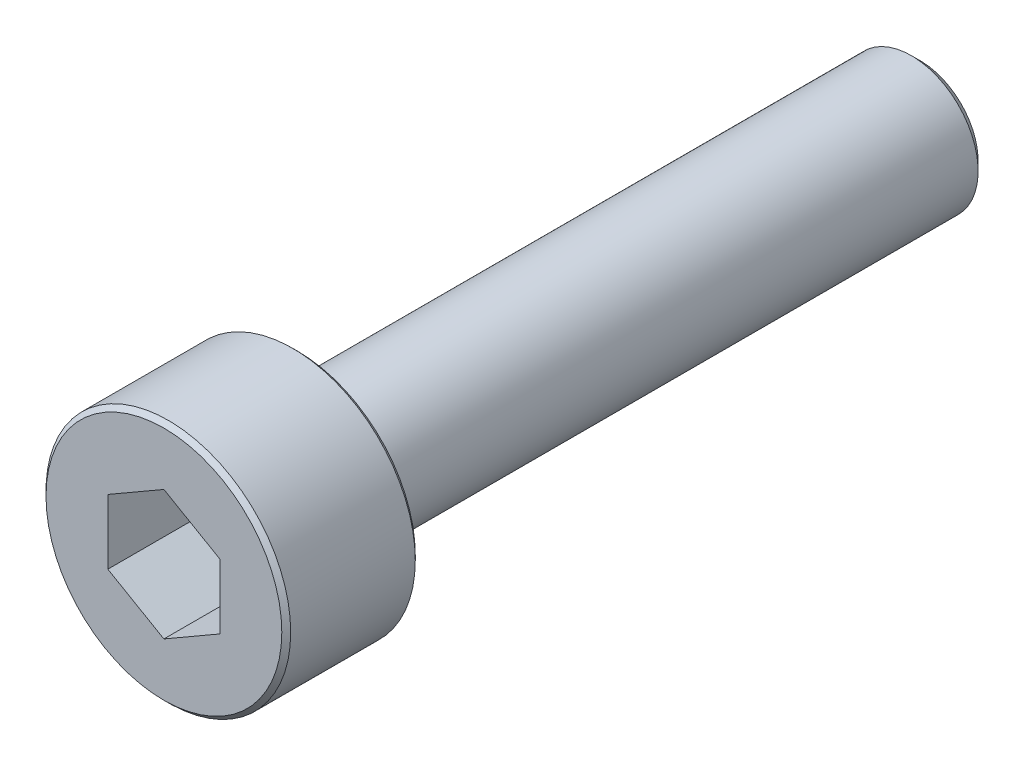
ISO-10303-21;
HEADER;
FILE_DESCRIPTION(('STEP AP214'),'2;1');
FILE_NAME('part.step','',(''),(''),'','','');
FILE_SCHEMA(('AUTOMOTIVE_DESIGN { 1 0 10303 214 1 1 1 1 }'));
ENDSEC;
DATA;
#1=APPLICATION_CONTEXT('core data for automotive mechanical design processes');
#2=APPLICATION_PROTOCOL_DEFINITION('international standard','automotive_design',2000,#1);
#3=PRODUCT_CONTEXT('',#1,'mechanical');
#4=PRODUCT('Part','Part','',(#3));
#5=PRODUCT_RELATED_PRODUCT_CATEGORY('part','',(#4));
#6=PRODUCT_DEFINITION_FORMATION('','',#4);
#7=PRODUCT_DEFINITION_CONTEXT('part definition',#1,'design');
#8=PRODUCT_DEFINITION('design','',#6,#7);
#9=PRODUCT_DEFINITION_SHAPE('','',#8);
#10=(LENGTH_UNIT() NAMED_UNIT(*) SI_UNIT(.MILLI.,.METRE.));
#11=(NAMED_UNIT(*) PLANE_ANGLE_UNIT() SI_UNIT($,.RADIAN.));
#12=(NAMED_UNIT(*) SI_UNIT($,.STERADIAN.) SOLID_ANGLE_UNIT());
#13=UNCERTAINTY_MEASURE_WITH_UNIT(LENGTH_MEASURE(1.E-05),#10,'distance_accuracy_value','');
#14=(GEOMETRIC_REPRESENTATION_CONTEXT(3) GLOBAL_UNCERTAINTY_ASSIGNED_CONTEXT((#13)) GLOBAL_UNIT_ASSIGNED_CONTEXT((#10,
#11,#12)) REPRESENTATION_CONTEXT('',''));
#15=CARTESIAN_POINT('',(0.,0.,0.));
#16=DIRECTION('',(0.,0.,1.));
#17=DIRECTION('',(1.,0.,0.));
#18=AXIS2_PLACEMENT_3D('',#15,#16,#17);
#19=CARTESIAN_POINT('',(0.,0.,14.));
#20=DIRECTION('',(0.,0.,1.));
#21=DIRECTION('',(1.,0.,0.));
#22=AXIS2_PLACEMENT_3D('',#19,#20,#21);
#23=CYLINDRICAL_SURFACE('',#22,2.75);
#24=CARTESIAN_POINT('',(0.,0.,14.1000011322329));
#25=DIRECTION('',(0.,0.,-1.));
#26=DIRECTION('',(-1.,0.,0.));
#27=AXIS2_PLACEMENT_3D('',#24,#25,#26);
#28=CIRCLE('',#27,2.75);
#29=CARTESIAN_POINT('',(-2.75,0.,14.1000011322329));
#30=VERTEX_POINT('',#29);
#31=EDGE_CURVE('E153',#30,#30,#28,.F.);
#32=ORIENTED_EDGE('',*,*,#31,.T.);
#33=EDGE_LOOP('',(#32));
#34=FACE_BOUND('',#33,.T.);
#35=CARTESIAN_POINT('',(0.,0.,16.8999988050689));
#36=DIRECTION('',(0.,0.,1.));
#37=DIRECTION('',(1.,0.,0.));
#38=AXIS2_PLACEMENT_3D('',#35,#36,#37);
#39=CIRCLE('',#38,2.75);
#40=CARTESIAN_POINT('',(2.75,0.,16.8999988050689));
#41=VERTEX_POINT('',#40);
#42=EDGE_CURVE('E150',#41,#41,#39,.F.);
#43=ORIENTED_EDGE('',*,*,#42,.T.);
#44=EDGE_LOOP('',(#43));
#45=FACE_BOUND('',#44,.T.);
#46=ADVANCED_FACE('F39',(#34,#45),#23,.T.);
#47=CARTESIAN_POINT('',(2.75,0.,14.));
#48=DIRECTION('',(0.,0.,-1.));
#49=DIRECTION('',(-1.,0.,0.));
#50=AXIS2_PLACEMENT_3D('',#47,#48,#49);
#51=PLANE('',#50);
#52=CARTESIAN_POINT('',(0.,0.,14.));
#53=DIRECTION('',(0.,0.,-1.));
#54=DIRECTION('',(-1.,0.,0.));
#55=AXIS2_PLACEMENT_3D('',#52,#53,#54);
#56=CIRCLE('',#55,2.64999880506886);
#57=CARTESIAN_POINT('',(-2.64999880506886,0.,14.));
#58=VERTEX_POINT('',#57);
#59=EDGE_CURVE('E156',#58,#58,#56,.T.);
#60=ORIENTED_EDGE('',*,*,#59,.T.);
#61=EDGE_LOOP('',(#60));
#62=FACE_BOUND('',#61,.T.);
#63=CARTESIAN_POINT('',(0.,0.,14.));
#64=DIRECTION('',(0.,0.,-1.));
#65=DIRECTION('',(-1.,0.,0.));
#66=AXIS2_PLACEMENT_3D('',#63,#64,#65);
#67=CIRCLE('',#66,1.5);
#68=CARTESIAN_POINT('',(-1.5,0.,14.));
#69=VERTEX_POINT('',#68);
#70=EDGE_CURVE('E142',#69,#69,#67,.T.);
#71=ORIENTED_EDGE('',*,*,#70,.F.);
#72=EDGE_LOOP('',(#71));
#73=FACE_BOUND('',#72,.T.);
#74=ADVANCED_FACE('F176',(#62,#73),#51,.T.);
#75=CARTESIAN_POINT('',(0.,0.,17.));
#76=DIRECTION('',(0.,0.,1.));
#77=DIRECTION('',(1.,0.,0.));
#78=AXIS2_PLACEMENT_3D('',#75,#76,#77);
#79=PLANE('',#78);
#80=CARTESIAN_POINT('',(0.,0.,17.));
#81=DIRECTION('',(0.,0.,1.));
#82=DIRECTION('',(1.,0.,0.));
#83=AXIS2_PLACEMENT_3D('',#80,#81,#82);
#84=CIRCLE('',#83,2.64999886776715);
#85=CARTESIAN_POINT('',(2.64999886776715,0.,17.));
#86=VERTEX_POINT('',#85);
#87=EDGE_CURVE('E159',#86,#86,#84,.T.);
#88=ORIENTED_EDGE('',*,*,#87,.T.);
#89=EDGE_LOOP('',(#88));
#90=FACE_BOUND('',#89,.T.);
#91=DIRECTION('',(0.,-1.,0.));
#92=VECTOR('',#91,1.);
#93=CARTESIAN_POINT('',(-1.26000000000002,0.727461339178926,17.));
#94=LINE('',#93,#92);
#95=CARTESIAN_POINT('',(-1.26000000000002,0.727461339178926,17.));
#96=VERTEX_POINT('',#95);
#97=CARTESIAN_POINT('',(-1.26,-0.7274613391789,17.));
#98=VERTEX_POINT('',#97);
#99=EDGE_CURVE('E55',#96,#98,#94,.T.);
#100=ORIENTED_EDGE('',*,*,#99,.F.);
#101=DIRECTION('',(-0.866025403784441,-0.499999999999996,0.));
#102=VECTOR('',#101,1.);
#103=CARTESIAN_POINT('',(0.,1.45492267835786,17.));
#104=LINE('',#103,#102);
#105=CARTESIAN_POINT('',(0.,1.45492267835786,17.));
#106=VERTEX_POINT('',#105);
#107=EDGE_CURVE('E138',#106,#96,#104,.T.);
#108=ORIENTED_EDGE('',*,*,#107,.F.);
#109=DIRECTION('',(-0.86602540378445,0.49999999999998,0.));
#110=VECTOR('',#109,1.);
#111=CARTESIAN_POINT('',(1.26000000000013,0.727461339178913,17.));
#112=LINE('',#111,#110);
#113=CARTESIAN_POINT('',(1.26000000000013,0.727461339178913,17.));
#114=VERTEX_POINT('',#113);
#115=EDGE_CURVE('E136',#114,#106,#112,.T.);
#116=ORIENTED_EDGE('',*,*,#115,.F.);
#117=DIRECTION('',(0.,1.,0.));
#118=VECTOR('',#117,1.);
#119=CARTESIAN_POINT('',(1.26000000000013,-0.727461339178913,17.));
#120=LINE('',#119,#118);
#121=CARTESIAN_POINT('',(1.26000000000013,-0.727461339178913,17.));
#122=VERTEX_POINT('',#121);
#123=EDGE_CURVE('E103',#122,#114,#120,.T.);
#124=ORIENTED_EDGE('',*,*,#123,.F.);
#125=DIRECTION('',(0.866025403784438,0.5,0.));
#126=VECTOR('',#125,1.);
#127=CARTESIAN_POINT('',(0.,-1.45492267835787,17.));
#128=LINE('',#127,#126);
#129=CARTESIAN_POINT('',(0.,-1.45492267835787,17.));
#130=VERTEX_POINT('',#129);
#131=EDGE_CURVE('E132',#130,#122,#128,.T.);
#132=ORIENTED_EDGE('',*,*,#131,.F.);
#133=DIRECTION('',(0.866025403784439,-0.5,0.));
#134=VECTOR('',#133,1.);
#135=CARTESIAN_POINT('',(-1.26,-0.7274613391789,17.));
#136=LINE('',#135,#134);
#137=EDGE_CURVE('E129',#98,#130,#136,.T.);
#138=ORIENTED_EDGE('',*,*,#137,.F.);
#139=EDGE_LOOP('',(#100,#108,#116,#124,#132,#138));
#140=FACE_BOUND('',#139,.T.);
#141=ADVANCED_FACE('F182',(#90,#140),#79,.T.);
#142=CARTESIAN_POINT('',(0.,0.,0.));
#143=DIRECTION('',(0.,0.,1.));
#144=DIRECTION('',(1.,0.,0.));
#145=AXIS2_PLACEMENT_3D('',#142,#143,#144);
#146=CYLINDRICAL_SURFACE('',#145,1.5);
#147=CARTESIAN_POINT('',(0.,0.,0.20000908227906));
#148=DIRECTION('',(0.,0.,-1.));
#149=DIRECTION('',(-1.,0.,0.));
#150=AXIS2_PLACEMENT_3D('',#147,#148,#149);
#151=CIRCLE('',#150,1.5);
#152=CARTESIAN_POINT('',(-1.5,0.,0.20000908227906));
#153=VERTEX_POINT('',#152);
#154=EDGE_CURVE('E11',#153,#153,#151,.F.);
#155=ORIENTED_EDGE('',*,*,#154,.T.);
#156=EDGE_LOOP('',(#155));
#157=FACE_BOUND('',#156,.T.);
#158=ORIENTED_EDGE('',*,*,#70,.T.);
#159=EDGE_LOOP('',(#158));
#160=FACE_BOUND('',#159,.T.);
#161=ADVANCED_FACE('F209',(#157,#160),#146,.T.);
#162=CARTESIAN_POINT('',(0.,0.,0.));
#163=DIRECTION('',(0.,0.,-1.));
#164=DIRECTION('',(-1.,0.,0.));
#165=AXIS2_PLACEMENT_3D('',#162,#163,#164);
#166=PLANE('',#165);
#167=CARTESIAN_POINT('',(0.,0.,0.));
#168=DIRECTION('',(0.,0.,-1.));
#169=DIRECTION('',(-1.,0.,0.));
#170=AXIS2_PLACEMENT_3D('',#167,#168,#169);
#171=CIRCLE('',#170,1.29999212875586);
#172=CARTESIAN_POINT('',(-1.29999212875586,0.,0.));
#173=VERTEX_POINT('',#172);
#174=EDGE_CURVE('E48',#173,#173,#171,.T.);
#175=ORIENTED_EDGE('',*,*,#174,.T.);
#176=EDGE_LOOP('',(#175));
#177=FACE_BOUND('',#176,.T.);
#178=ADVANCED_FACE('F164',(#177),#166,.T.);
#179=CARTESIAN_POINT('',(-1.26000000000002,0.727461339178926,14.75));
#180=DIRECTION('',(-1.,0.,0.));
#181=DIRECTION('',(0.,-1.,0.));
#182=AXIS2_PLACEMENT_3D('',#179,#180,#181);
#183=PLANE('',#182);
#184=ORIENTED_EDGE('',*,*,#99,.T.);
#185=DIRECTION('',(0.,0.,1.));
#186=VECTOR('',#185,1.);
#187=CARTESIAN_POINT('',(-1.26,-0.7274613391789,14.75));
#188=LINE('',#187,#186);
#189=CARTESIAN_POINT('',(-1.26,-0.7274613391789,14.75));
#190=VERTEX_POINT('',#189);
#191=EDGE_CURVE('E85',#190,#98,#188,.T.);
#192=ORIENTED_EDGE('',*,*,#191,.F.);
#193=DIRECTION('',(0.,-1.,0.));
#194=VECTOR('',#193,1.);
#195=CARTESIAN_POINT('',(-1.26000000000002,0.727461339178926,14.75));
#196=LINE('',#195,#194);
#197=CARTESIAN_POINT('',(-1.26000000000002,0.727461339178926,14.75));
#198=VERTEX_POINT('',#197);
#199=EDGE_CURVE('E140',#198,#190,#196,.T.);
#200=ORIENTED_EDGE('',*,*,#199,.F.);
#201=DIRECTION('',(0.,0.,1.));
#202=VECTOR('',#201,1.);
#203=CARTESIAN_POINT('',(-1.26000000000002,0.727461339178926,14.75));
#204=LINE('',#203,#202);
#205=EDGE_CURVE('E63',#198,#96,#204,.T.);
#206=ORIENTED_EDGE('',*,*,#205,.T.);
#207=EDGE_LOOP('',(#184,#192,#200,#206));
#208=FACE_BOUND('',#207,.T.);
#209=ADVANCED_FACE('F217',(#208),#183,.F.);
#210=CARTESIAN_POINT('',(0.,1.45492267835786,14.75));
#211=DIRECTION('',(-0.499999999999996,0.866025403784441,0.));
#212=DIRECTION('',(-0.866025403784441,-0.499999999999996,0.));
#213=AXIS2_PLACEMENT_3D('',#210,#211,#212);
#214=PLANE('',#213);
#215=ORIENTED_EDGE('',*,*,#107,.T.);
#216=ORIENTED_EDGE('',*,*,#205,.F.);
#217=DIRECTION('',(-0.866025403784441,-0.499999999999996,0.));
#218=VECTOR('',#217,1.);
#219=CARTESIAN_POINT('',(0.,1.45492267835786,14.75));
#220=LINE('',#219,#218);
#221=CARTESIAN_POINT('',(0.,1.45492267835786,14.75));
#222=VERTEX_POINT('',#221);
#223=EDGE_CURVE('E115',#222,#198,#220,.T.);
#224=ORIENTED_EDGE('',*,*,#223,.F.);
#225=DIRECTION('',(0.,0.,1.));
#226=VECTOR('',#225,1.);
#227=CARTESIAN_POINT('',(0.,1.45492267835786,14.75));
#228=LINE('',#227,#226);
#229=EDGE_CURVE('E107',#222,#106,#228,.T.);
#230=ORIENTED_EDGE('',*,*,#229,.T.);
#231=EDGE_LOOP('',(#215,#216,#224,#230));
#232=FACE_BOUND('',#231,.T.);
#233=ADVANCED_FACE('F223',(#232),#214,.F.);
#234=CARTESIAN_POINT('',(1.26000000000013,0.727461339178913,14.75));
#235=DIRECTION('',(0.49999999999998,0.86602540378445,0.));
#236=DIRECTION('',(-0.86602540378445,0.49999999999998,0.));
#237=AXIS2_PLACEMENT_3D('',#234,#235,#236);
#238=PLANE('',#237);
#239=ORIENTED_EDGE('',*,*,#115,.T.);
#240=ORIENTED_EDGE('',*,*,#229,.F.);
#241=DIRECTION('',(-0.86602540378445,0.49999999999998,0.));
#242=VECTOR('',#241,1.);
#243=CARTESIAN_POINT('',(1.26000000000013,0.727461339178913,14.75));
#244=LINE('',#243,#242);
#245=CARTESIAN_POINT('',(1.26000000000013,0.727461339178913,14.75));
#246=VERTEX_POINT('',#245);
#247=EDGE_CURVE('E111',#246,#222,#244,.T.);
#248=ORIENTED_EDGE('',*,*,#247,.F.);
#249=DIRECTION('',(0.,0.,1.));
#250=VECTOR('',#249,1.);
#251=CARTESIAN_POINT('',(1.26000000000013,0.727461339178913,14.75));
#252=LINE('',#251,#250);
#253=EDGE_CURVE('E96',#246,#114,#252,.T.);
#254=ORIENTED_EDGE('',*,*,#253,.T.);
#255=EDGE_LOOP('',(#239,#240,#248,#254));
#256=FACE_BOUND('',#255,.T.);
#257=ADVANCED_FACE('F112',(#256),#238,.F.);
#258=CARTESIAN_POINT('',(1.26000000000013,-0.727461339178913,14.75));
#259=DIRECTION('',(1.,0.,0.));
#260=DIRECTION('',(0.,0.,-1.));
#261=AXIS2_PLACEMENT_3D('',#258,#259,#260);
#262=PLANE('',#261);
#263=ORIENTED_EDGE('',*,*,#123,.T.);
#264=ORIENTED_EDGE('',*,*,#253,.F.);
#265=DIRECTION('',(0.,1.,0.));
#266=VECTOR('',#265,1.);
#267=CARTESIAN_POINT('',(1.26000000000013,-0.727461339178913,14.75));
#268=LINE('',#267,#266);
#269=CARTESIAN_POINT('',(1.26000000000013,-0.727461339178913,14.75));
#270=VERTEX_POINT('',#269);
#271=EDGE_CURVE('E100',#270,#246,#268,.T.);
#272=ORIENTED_EDGE('',*,*,#271,.F.);
#273=DIRECTION('',(0.,0.,1.));
#274=VECTOR('',#273,1.);
#275=CARTESIAN_POINT('',(1.26000000000013,-0.727461339178913,14.75));
#276=LINE('',#275,#274);
#277=EDGE_CURVE('E108',#270,#122,#276,.T.);
#278=ORIENTED_EDGE('',*,*,#277,.T.);
#279=EDGE_LOOP('',(#263,#264,#272,#278));
#280=FACE_BOUND('',#279,.T.);
#281=ADVANCED_FACE('F98',(#280),#262,.F.);
#282=CARTESIAN_POINT('',(0.,-1.45492267835787,14.75));
#283=DIRECTION('',(0.5,-0.866025403784439,0.));
#284=DIRECTION('',(0.866025403784439,0.5,0.));
#285=AXIS2_PLACEMENT_3D('',#282,#283,#284);
#286=PLANE('',#285);
#287=ORIENTED_EDGE('',*,*,#131,.T.);
#288=ORIENTED_EDGE('',*,*,#277,.F.);
#289=DIRECTION('',(0.866025403784438,0.5,0.));
#290=VECTOR('',#289,1.);
#291=CARTESIAN_POINT('',(0.,-1.45492267835787,14.75));
#292=LINE('',#291,#290);
#293=CARTESIAN_POINT('',(0.,-1.45492267835787,14.75));
#294=VERTEX_POINT('',#293);
#295=EDGE_CURVE('E121',#294,#270,#292,.T.);
#296=ORIENTED_EDGE('',*,*,#295,.F.);
#297=DIRECTION('',(0.,0.,1.));
#298=VECTOR('',#297,1.);
#299=CARTESIAN_POINT('',(0.,-1.45492267835787,14.75));
#300=LINE('',#299,#298);
#301=EDGE_CURVE('E145',#294,#130,#300,.T.);
#302=ORIENTED_EDGE('',*,*,#301,.T.);
#303=EDGE_LOOP('',(#287,#288,#296,#302));
#304=FACE_BOUND('',#303,.T.);
#305=ADVANCED_FACE('F226',(#304),#286,.F.);
#306=CARTESIAN_POINT('',(-1.26,-0.7274613391789,14.75));
#307=DIRECTION('',(-0.5,-0.866025403784439,0.));
#308=DIRECTION('',(0.866025403784439,-0.5,0.));
#309=AXIS2_PLACEMENT_3D('',#306,#307,#308);
#310=PLANE('',#309);
#311=ORIENTED_EDGE('',*,*,#137,.T.);
#312=ORIENTED_EDGE('',*,*,#301,.F.);
#313=DIRECTION('',(0.866025403784439,-0.5,0.));
#314=VECTOR('',#313,1.);
#315=CARTESIAN_POINT('',(-1.26,-0.7274613391789,14.75));
#316=LINE('',#315,#314);
#317=EDGE_CURVE('E123',#190,#294,#316,.T.);
#318=ORIENTED_EDGE('',*,*,#317,.F.);
#319=ORIENTED_EDGE('',*,*,#191,.T.);
#320=EDGE_LOOP('',(#311,#312,#318,#319));
#321=FACE_BOUND('',#320,.T.);
#322=ADVANCED_FACE('F201',(#321),#310,.F.);
#323=CARTESIAN_POINT('',(0.,0.,14.75));
#324=DIRECTION('',(0.,0.,1.));
#325=DIRECTION('',(1.,0.,0.));
#326=AXIS2_PLACEMENT_3D('',#323,#324,#325);
#327=PLANE('',#326);
#328=ORIENTED_EDGE('',*,*,#199,.T.);
#329=ORIENTED_EDGE('',*,*,#317,.T.);
#330=ORIENTED_EDGE('',*,*,#295,.T.);
#331=ORIENTED_EDGE('',*,*,#271,.T.);
#332=ORIENTED_EDGE('',*,*,#247,.T.);
#333=ORIENTED_EDGE('',*,*,#223,.T.);
#334=EDGE_LOOP('',(#328,#329,#330,#331,#332,#333));
#335=FACE_BOUND('',#334,.T.);
#336=ADVANCED_FACE('F118',(#335),#327,.T.);
#337=CARTESIAN_POINT('',(0.,0.,14.1000011322329));
#338=DIRECTION('',(0.,0.,1.));
#339=DIRECTION('',(1.,0.,0.));
#340=AXIS2_PLACEMENT_3D('',#337,#338,#339);
#341=CONICAL_SURFACE('',#340,2.75,0.785398476885225);
#342=ORIENTED_EDGE('',*,*,#59,.F.);
#343=EDGE_LOOP('',(#342));
#344=FACE_BOUND('',#343,.T.);
#345=ORIENTED_EDGE('',*,*,#31,.F.);
#346=EDGE_LOOP('',(#345));
#347=FACE_BOUND('',#346,.T.);
#348=ADVANCED_FACE('F172',(#344,#347),#341,.T.);
#349=CARTESIAN_POINT('',(0.,0.,17.));
#350=DIRECTION('',(0.,0.,-1.));
#351=DIRECTION('',(-1.,0.,0.));
#352=AXIS2_PLACEMENT_3D('',#349,#350,#351);
#353=CONICAL_SURFACE('',#352,2.64999886776715,0.785397849909645);
#354=ORIENTED_EDGE('',*,*,#42,.F.);
#355=EDGE_LOOP('',(#354));
#356=FACE_BOUND('',#355,.T.);
#357=ORIENTED_EDGE('',*,*,#87,.F.);
#358=EDGE_LOOP('',(#357));
#359=FACE_BOUND('',#358,.T.);
#360=ADVANCED_FACE('F167',(#356,#359),#353,.T.);
#361=CARTESIAN_POINT('',(0.,0.,0.));
#362=DIRECTION('',(0.,0.,1.));
#363=DIRECTION('',(1.,0.,0.));
#364=AXIS2_PLACEMENT_3D('',#361,#362,#363);
#365=CONICAL_SURFACE('',#364,1.29999212875586,0.785395135938455);
#366=ORIENTED_EDGE('',*,*,#154,.F.);
#367=EDGE_LOOP('',(#366));
#368=FACE_BOUND('',#367,.T.);
#369=ORIENTED_EDGE('',*,*,#174,.F.);
#370=EDGE_LOOP('',(#369));
#371=FACE_BOUND('',#370,.T.);
#372=ADVANCED_FACE('F42',(#368,#371),#365,.T.);
#373=CLOSED_SHELL('',(#46,#74,#141,#161,#178,#209,#233,#257,#281,#305,#322,#336,#348,#360,#372));
#374=MANIFOLD_SOLID_BREP('B2',#373);
#375=ADVANCED_BREP_SHAPE_REPRESENTATION('',(#18,#374),#14);
#376=SHAPE_DEFINITION_REPRESENTATION(#9,#375);
ENDSEC;
END-ISO-10303-21;
